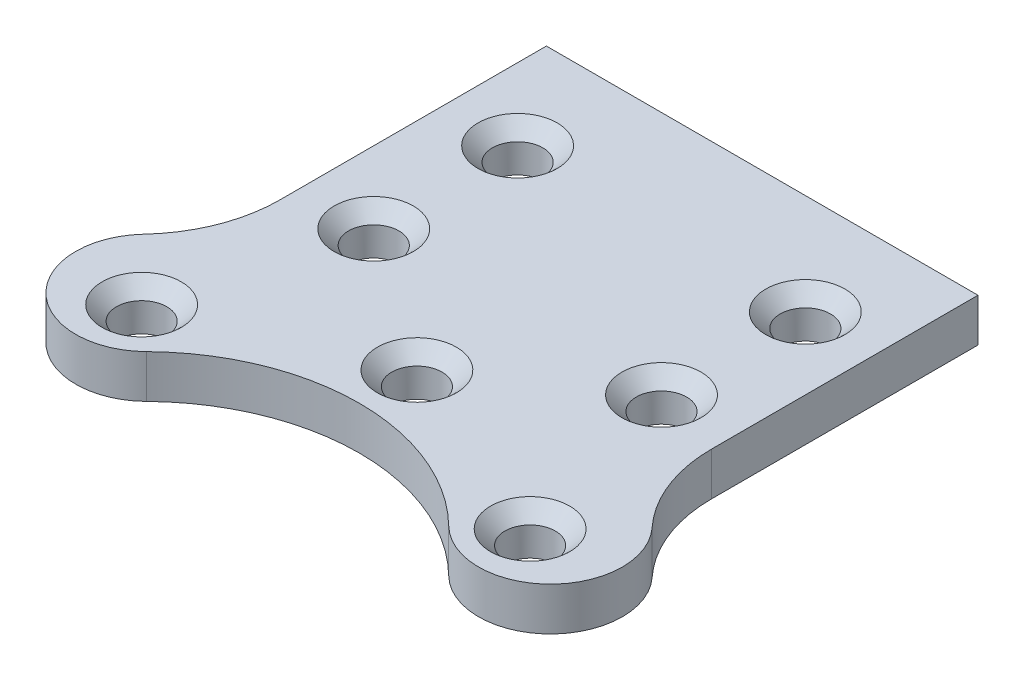
ISO-10303-21;
HEADER;
FILE_DESCRIPTION(('STEP AP214'),'2;1');
FILE_NAME('part.step','',(''),(''),'','','');
FILE_SCHEMA(('AUTOMOTIVE_DESIGN { 1 0 10303 214 1 1 1 1 }'));
ENDSEC;
DATA;
#1=APPLICATION_CONTEXT('core data for automotive mechanical design processes');
#2=APPLICATION_PROTOCOL_DEFINITION('international standard','automotive_design',2000,#1);
#3=PRODUCT_CONTEXT('',#1,'mechanical');
#4=PRODUCT('Part','Part','',(#3));
#5=PRODUCT_RELATED_PRODUCT_CATEGORY('part','',(#4));
#6=PRODUCT_DEFINITION_FORMATION('','',#4);
#7=PRODUCT_DEFINITION_CONTEXT('part definition',#1,'design');
#8=PRODUCT_DEFINITION('design','',#6,#7);
#9=PRODUCT_DEFINITION_SHAPE('','',#8);
#10=(LENGTH_UNIT() NAMED_UNIT(*) SI_UNIT(.MILLI.,.METRE.));
#11=(NAMED_UNIT(*) PLANE_ANGLE_UNIT() SI_UNIT($,.RADIAN.));
#12=(NAMED_UNIT(*) SI_UNIT($,.STERADIAN.) SOLID_ANGLE_UNIT());
#13=UNCERTAINTY_MEASURE_WITH_UNIT(LENGTH_MEASURE(1.E-05),#10,'distance_accuracy_value','');
#14=(GEOMETRIC_REPRESENTATION_CONTEXT(3) GLOBAL_UNCERTAINTY_ASSIGNED_CONTEXT((#13)) GLOBAL_UNIT_ASSIGNED_CONTEXT((#10,
#11,#12)) REPRESENTATION_CONTEXT('',''));
#15=CARTESIAN_POINT('',(0.,0.,0.));
#16=DIRECTION('',(0.,0.,1.));
#17=DIRECTION('',(1.,0.,0.));
#18=AXIS2_PLACEMENT_3D('',#15,#16,#17);
#19=CARTESIAN_POINT('',(0.,3.,15.));
#20=DIRECTION('',(0.,-1.,0.));
#21=DIRECTION('',(0.,0.,-1.));
#22=AXIS2_PLACEMENT_3D('',#19,#20,#21);
#23=CYLINDRICAL_SURFACE('',#22,15.);
#24=CARTESIAN_POINT('',(0.,0.,15.));
#25=DIRECTION('',(0.,-1.,0.));
#26=DIRECTION('',(0.,0.,-1.));
#27=AXIS2_PLACEMENT_3D('',#24,#25,#26);
#28=CIRCLE('',#27,15.);
#29=CARTESIAN_POINT('',(-10.5,0.,4.28785735718572));
#30=VERTEX_POINT('',#29);
#31=CARTESIAN_POINT('',(10.5,0.,4.28785735718573));
#32=VERTEX_POINT('',#31);
#33=EDGE_CURVE('E124',#30,#32,#28,.T.);
#34=ORIENTED_EDGE('',*,*,#33,.T.);
#35=DIRECTION('',(0.,-1.,0.));
#36=VECTOR('',#35,1.);
#37=CARTESIAN_POINT('',(10.5,3.,4.28785735718573));
#38=LINE('',#37,#36);
#39=CARTESIAN_POINT('',(10.5,3.,4.28785735718573));
#40=VERTEX_POINT('',#39);
#41=EDGE_CURVE('E105',#40,#32,#38,.T.);
#42=ORIENTED_EDGE('',*,*,#41,.F.);
#43=CARTESIAN_POINT('',(0.,3.,15.));
#44=DIRECTION('',(0.,-1.,0.));
#45=DIRECTION('',(0.,0.,-1.));
#46=AXIS2_PLACEMENT_3D('',#43,#44,#45);
#47=CIRCLE('',#46,15.);
#48=CARTESIAN_POINT('',(-10.5,3.,4.28785735718572));
#49=VERTEX_POINT('',#48);
#50=EDGE_CURVE('E112',#49,#40,#47,.T.);
#51=ORIENTED_EDGE('',*,*,#50,.F.);
#52=DIRECTION('',(0.,-1.,0.));
#53=VECTOR('',#52,1.);
#54=CARTESIAN_POINT('',(-10.5,3.,4.28785735718572));
#55=LINE('',#54,#53);
#56=EDGE_CURVE('E263',#49,#30,#55,.T.);
#57=ORIENTED_EDGE('',*,*,#56,.T.);
#58=EDGE_LOOP('',(#34,#42,#51,#57));
#59=FACE_BOUND('',#58,.T.);
#60=ADVANCED_FACE('F33',(#59),#23,.F.);
#61=CARTESIAN_POINT('',(14.,3.,0.717143142914298));
#62=DIRECTION('',(0.,-1.,0.));
#63=DIRECTION('',(0.,0.,-1.));
#64=AXIS2_PLACEMENT_3D('',#61,#62,#63);
#65=CYLINDRICAL_SURFACE('',#64,5.);
#66=CARTESIAN_POINT('',(14.,0.,0.717143142914298));
#67=DIRECTION('',(0.,1.,0.));
#68=DIRECTION('',(0.,0.,1.));
#69=AXIS2_PLACEMENT_3D('',#66,#67,#68);
#70=CIRCLE('',#69,5.);
#71=CARTESIAN_POINT('',(17.6666666666667,0.,-2.68220319948089));
#72=VERTEX_POINT('',#71);
#73=EDGE_CURVE('E251',#32,#72,#70,.T.);
#74=ORIENTED_EDGE('',*,*,#73,.T.);
#75=DIRECTION('',(0.,-1.,0.));
#76=VECTOR('',#75,1.);
#77=CARTESIAN_POINT('',(17.6666666666667,3.,-2.68220319948089));
#78=LINE('',#77,#76);
#79=CARTESIAN_POINT('',(17.6666666666667,3.,-2.68220319948089));
#80=VERTEX_POINT('',#79);
#81=EDGE_CURVE('E108',#72,#80,#78,.F.);
#82=ORIENTED_EDGE('',*,*,#81,.T.);
#83=CARTESIAN_POINT('',(14.,3.,0.717143142914298));
#84=DIRECTION('',(0.,1.,0.));
#85=DIRECTION('',(0.,0.,1.));
#86=AXIS2_PLACEMENT_3D('',#83,#84,#85);
#87=CIRCLE('',#86,5.);
#88=EDGE_CURVE('E100',#40,#80,#87,.T.);
#89=ORIENTED_EDGE('',*,*,#88,.F.);
#90=ORIENTED_EDGE('',*,*,#41,.T.);
#91=EDGE_LOOP('',(#74,#82,#89,#90));
#92=FACE_BOUND('',#91,.T.);
#93=ADVANCED_FACE('F103',(#92),#65,.T.);
#94=CARTESIAN_POINT('',(15.,3.,-28.));
#95=DIRECTION('',(-1.,0.,0.));
#96=DIRECTION('',(0.,0.,1.));
#97=AXIS2_PLACEMENT_3D('',#94,#95,#96);
#98=PLANE('',#97);
#99=DIRECTION('',(0.,0.,-1.));
#100=VECTOR('',#99,1.);
#101=CARTESIAN_POINT('',(15.,3.,-28.));
#102=LINE('',#101,#100);
#103=CARTESIAN_POINT('',(15.,3.,-9.48089588427127));
#104=VERTEX_POINT('',#103);
#105=CARTESIAN_POINT('',(15.,3.,-28.));
#106=VERTEX_POINT('',#105);
#107=EDGE_CURVE('E111',#104,#106,#102,.T.);
#108=ORIENTED_EDGE('',*,*,#107,.F.);
#109=DIRECTION('',(0.,1.,0.));
#110=VECTOR('',#109,1.);
#111=CARTESIAN_POINT('',(15.,0.,-9.48089588427127));
#112=LINE('',#111,#110);
#113=CARTESIAN_POINT('',(15.,0.,-9.48089588427127));
#114=VERTEX_POINT('',#113);
#115=EDGE_CURVE('E125',#104,#114,#112,.F.);
#116=ORIENTED_EDGE('',*,*,#115,.T.);
#117=DIRECTION('',(0.,0.,-1.));
#118=VECTOR('',#117,1.);
#119=CARTESIAN_POINT('',(15.,0.,-28.));
#120=LINE('',#119,#118);
#121=CARTESIAN_POINT('',(15.,0.,-28.));
#122=VERTEX_POINT('',#121);
#123=EDGE_CURVE('E266',#114,#122,#120,.T.);
#124=ORIENTED_EDGE('',*,*,#123,.T.);
#125=DIRECTION('',(0.,-1.,0.));
#126=VECTOR('',#125,1.);
#127=CARTESIAN_POINT('',(15.,3.,-28.));
#128=LINE('',#127,#126);
#129=EDGE_CURVE('E126',#106,#122,#128,.T.);
#130=ORIENTED_EDGE('',*,*,#129,.F.);
#131=EDGE_LOOP('',(#108,#116,#124,#130));
#132=FACE_BOUND('',#131,.T.);
#133=ADVANCED_FACE('F206',(#132),#98,.F.);
#134=CARTESIAN_POINT('',(-15.,3.,-28.));
#135=DIRECTION('',(0.,0.,1.));
#136=DIRECTION('',(1.,0.,0.));
#137=AXIS2_PLACEMENT_3D('',#134,#135,#136);
#138=PLANE('',#137);
#139=DIRECTION('',(-1.,0.,0.));
#140=VECTOR('',#139,1.);
#141=CARTESIAN_POINT('',(-15.,0.,-28.));
#142=LINE('',#141,#140);
#143=CARTESIAN_POINT('',(-15.,0.,-28.));
#144=VERTEX_POINT('',#143);
#145=EDGE_CURVE('E268',#122,#144,#142,.T.);
#146=ORIENTED_EDGE('',*,*,#145,.T.);
#147=DIRECTION('',(0.,-1.,0.));
#148=VECTOR('',#147,1.);
#149=CARTESIAN_POINT('',(-15.,3.,-28.));
#150=LINE('',#149,#148);
#151=CARTESIAN_POINT('',(-15.,3.,-28.));
#152=VERTEX_POINT('',#151);
#153=EDGE_CURVE('E131',#152,#144,#150,.T.);
#154=ORIENTED_EDGE('',*,*,#153,.F.);
#155=DIRECTION('',(-1.,0.,0.));
#156=VECTOR('',#155,1.);
#157=CARTESIAN_POINT('',(-15.,3.,-28.));
#158=LINE('',#157,#156);
#159=EDGE_CURVE('E259',#106,#152,#158,.T.);
#160=ORIENTED_EDGE('',*,*,#159,.F.);
#161=ORIENTED_EDGE('',*,*,#129,.T.);
#162=EDGE_LOOP('',(#146,#154,#160,#161));
#163=FACE_BOUND('',#162,.T.);
#164=ADVANCED_FACE('F280',(#163),#138,.F.);
#165=CARTESIAN_POINT('',(-15.,3.,-4.18183634265206));
#166=DIRECTION('',(1.,0.,0.));
#167=DIRECTION('',(0.,0.,-1.));
#168=AXIS2_PLACEMENT_3D('',#165,#166,#167);
#169=PLANE('',#168);
#170=DIRECTION('',(0.,0.,1.));
#171=VECTOR('',#170,1.);
#172=CARTESIAN_POINT('',(-15.,0.,-4.18183634265206));
#173=LINE('',#172,#171);
#174=CARTESIAN_POINT('',(-15.,0.,-9.48089588427127));
#175=VERTEX_POINT('',#174);
#176=EDGE_CURVE('E270',#144,#175,#173,.T.);
#177=ORIENTED_EDGE('',*,*,#176,.T.);
#178=DIRECTION('',(0.,1.,0.));
#179=VECTOR('',#178,1.);
#180=CARTESIAN_POINT('',(-15.,3.,-9.48089588427127));
#181=LINE('',#180,#179);
#182=CARTESIAN_POINT('',(-15.,3.,-9.48089588427127));
#183=VERTEX_POINT('',#182);
#184=EDGE_CURVE('E48',#175,#183,#181,.T.);
#185=ORIENTED_EDGE('',*,*,#184,.T.);
#186=DIRECTION('',(0.,0.,1.));
#187=VECTOR('',#186,1.);
#188=CARTESIAN_POINT('',(-15.,3.,-4.18183634265206));
#189=LINE('',#188,#187);
#190=EDGE_CURVE('E261',#152,#183,#189,.T.);
#191=ORIENTED_EDGE('',*,*,#190,.F.);
#192=ORIENTED_EDGE('',*,*,#153,.T.);
#193=EDGE_LOOP('',(#177,#185,#191,#192));
#194=FACE_BOUND('',#193,.T.);
#195=ADVANCED_FACE('F275',(#194),#169,.F.);
#196=CARTESIAN_POINT('',(-14.,3.,0.717143142914298));
#197=DIRECTION('',(0.,-1.,0.));
#198=DIRECTION('',(0.,0.,-1.));
#199=AXIS2_PLACEMENT_3D('',#196,#197,#198);
#200=CYLINDRICAL_SURFACE('',#199,5.);
#201=CARTESIAN_POINT('',(-14.,3.,0.717143142914298));
#202=DIRECTION('',(0.,1.,0.));
#203=DIRECTION('',(0.,0.,-1.));
#204=AXIS2_PLACEMENT_3D('',#201,#202,#203);
#205=CIRCLE('',#204,5.);
#206=CARTESIAN_POINT('',(-17.6666666666667,3.,-2.68220319948089));
#207=VERTEX_POINT('',#206);
#208=EDGE_CURVE('E117',#207,#49,#205,.T.);
#209=ORIENTED_EDGE('',*,*,#208,.F.);
#210=DIRECTION('',(0.,-1.,0.));
#211=VECTOR('',#210,1.);
#212=CARTESIAN_POINT('',(-17.6666666666667,3.,-2.68220319948089));
#213=LINE('',#212,#211);
#214=CARTESIAN_POINT('',(-17.6666666666667,0.,-2.68220319948089));
#215=VERTEX_POINT('',#214);
#216=EDGE_CURVE('E136',#207,#215,#213,.T.);
#217=ORIENTED_EDGE('',*,*,#216,.T.);
#218=CARTESIAN_POINT('',(-14.,0.,0.717143142914298));
#219=DIRECTION('',(0.,1.,0.));
#220=DIRECTION('',(0.,0.,-1.));
#221=AXIS2_PLACEMENT_3D('',#218,#219,#220);
#222=CIRCLE('',#221,5.);
#223=EDGE_CURVE('E121',#215,#30,#222,.T.);
#224=ORIENTED_EDGE('',*,*,#223,.T.);
#225=ORIENTED_EDGE('',*,*,#56,.F.);
#226=EDGE_LOOP('',(#209,#217,#224,#225));
#227=FACE_BOUND('',#226,.T.);
#228=ADVANCED_FACE('F286',(#227),#200,.T.);
#229=CARTESIAN_POINT('',(0.,3.,15.));
#230=DIRECTION('',(0.,-1.,0.));
#231=DIRECTION('',(0.,0.,-1.));
#232=AXIS2_PLACEMENT_3D('',#229,#230,#231);
#233=PLANE('',#232);
#234=CARTESIAN_POINT('',(13.5,3.,1.63025804287906));
#235=DIRECTION('',(0.,-1.,0.));
#236=DIRECTION('',(0.,0.,-1.));
#237=AXIS2_PLACEMENT_3D('',#234,#235,#236);
#238=CIRCLE('',#237,2.75);
#239=CARTESIAN_POINT('',(13.5,3.,-1.11974195712094));
#240=VERTEX_POINT('',#239);
#241=EDGE_CURVE('E168',#240,#240,#238,.T.);
#242=ORIENTED_EDGE('',*,*,#241,.T.);
#243=EDGE_LOOP('',(#242));
#244=FACE_BOUND('',#243,.T.);
#245=CARTESIAN_POINT('',(-13.5,3.,1.63025804287906));
#246=DIRECTION('',(0.,-1.,0.));
#247=DIRECTION('',(0.,0.,-1.));
#248=AXIS2_PLACEMENT_3D('',#245,#246,#247);
#249=CIRCLE('',#248,2.75);
#250=CARTESIAN_POINT('',(-13.5,3.,-1.11974195712094));
#251=VERTEX_POINT('',#250);
#252=EDGE_CURVE('E165',#251,#251,#249,.T.);
#253=ORIENTED_EDGE('',*,*,#252,.T.);
#254=EDGE_LOOP('',(#253));
#255=FACE_BOUND('',#254,.T.);
#256=CARTESIAN_POINT('',(-10.,3.,-11.));
#257=DIRECTION('',(0.,-1.,0.));
#258=DIRECTION('',(0.,0.,-1.));
#259=AXIS2_PLACEMENT_3D('',#256,#257,#258);
#260=CIRCLE('',#259,2.75000000000001);
#261=CARTESIAN_POINT('',(-10.,3.,-13.75));
#262=VERTEX_POINT('',#261);
#263=EDGE_CURVE('E162',#262,#262,#260,.T.);
#264=ORIENTED_EDGE('',*,*,#263,.T.);
#265=EDGE_LOOP('',(#264));
#266=FACE_BOUND('',#265,.T.);
#267=CARTESIAN_POINT('',(0.,3.,-4.));
#268=DIRECTION('',(0.,-1.,0.));
#269=DIRECTION('',(0.,0.,-1.));
#270=AXIS2_PLACEMENT_3D('',#267,#268,#269);
#271=CIRCLE('',#270,2.75);
#272=CARTESIAN_POINT('',(0.,3.,-6.75));
#273=VERTEX_POINT('',#272);
#274=EDGE_CURVE('E159',#273,#273,#271,.T.);
#275=ORIENTED_EDGE('',*,*,#274,.T.);
#276=EDGE_LOOP('',(#275));
#277=FACE_BOUND('',#276,.T.);
#278=CARTESIAN_POINT('',(10.,3.,-11.));
#279=DIRECTION('',(0.,-1.,0.));
#280=DIRECTION('',(0.,0.,-1.));
#281=AXIS2_PLACEMENT_3D('',#278,#279,#280);
#282=CIRCLE('',#281,2.75000000000001);
#283=CARTESIAN_POINT('',(10.,3.,-13.75));
#284=VERTEX_POINT('',#283);
#285=EDGE_CURVE('E156',#284,#284,#282,.T.);
#286=ORIENTED_EDGE('',*,*,#285,.T.);
#287=EDGE_LOOP('',(#286));
#288=FACE_BOUND('',#287,.T.);
#289=CARTESIAN_POINT('',(10.,3.,-21.));
#290=DIRECTION('',(0.,-1.,0.));
#291=DIRECTION('',(0.,0.,-1.));
#292=AXIS2_PLACEMENT_3D('',#289,#290,#291);
#293=CIRCLE('',#292,2.75);
#294=CARTESIAN_POINT('',(10.,3.,-23.75));
#295=VERTEX_POINT('',#294);
#296=EDGE_CURVE('E153',#295,#295,#293,.T.);
#297=ORIENTED_EDGE('',*,*,#296,.T.);
#298=EDGE_LOOP('',(#297));
#299=FACE_BOUND('',#298,.T.);
#300=CARTESIAN_POINT('',(-10.,3.,-21.));
#301=DIRECTION('',(0.,-1.,0.));
#302=DIRECTION('',(0.,0.,-1.));
#303=AXIS2_PLACEMENT_3D('',#300,#301,#302);
#304=CIRCLE('',#303,2.75);
#305=CARTESIAN_POINT('',(-10.,3.,-23.75));
#306=VERTEX_POINT('',#305);
#307=EDGE_CURVE('E150',#306,#306,#304,.T.);
#308=ORIENTED_EDGE('',*,*,#307,.T.);
#309=EDGE_LOOP('',(#308));
#310=FACE_BOUND('',#309,.T.);
#311=ORIENTED_EDGE('',*,*,#50,.T.);
#312=ORIENTED_EDGE('',*,*,#88,.T.);
#313=CARTESIAN_POINT('',(25.,3.,-9.48089588427127));
#314=DIRECTION('',(0.,-1.,0.));
#315=DIRECTION('',(0.,0.,-1.));
#316=AXIS2_PLACEMENT_3D('',#313,#314,#315);
#317=CIRCLE('',#316,10.);
#318=EDGE_CURVE('E142',#80,#104,#317,.T.);
#319=ORIENTED_EDGE('',*,*,#318,.T.);
#320=ORIENTED_EDGE('',*,*,#107,.T.);
#321=ORIENTED_EDGE('',*,*,#159,.T.);
#322=ORIENTED_EDGE('',*,*,#190,.T.);
#323=CARTESIAN_POINT('',(-25.,3.,-9.48089588427127));
#324=DIRECTION('',(0.,-1.,0.));
#325=DIRECTION('',(0.,0.,-1.));
#326=AXIS2_PLACEMENT_3D('',#323,#324,#325);
#327=CIRCLE('',#326,10.);
#328=EDGE_CURVE('E145',#183,#207,#327,.T.);
#329=ORIENTED_EDGE('',*,*,#328,.T.);
#330=ORIENTED_EDGE('',*,*,#208,.T.);
#331=EDGE_LOOP('',(#311,#312,#319,#320,#321,#322,#329,#330));
#332=FACE_BOUND('',#331,.T.);
#333=ADVANCED_FACE('F115',(#244,#255,#266,#277,#288,#299,#310,#332),#233,.F.);
#334=CARTESIAN_POINT('',(0.,0.,15.));
#335=DIRECTION('',(0.,-1.,0.));
#336=DIRECTION('',(0.,0.,-1.));
#337=AXIS2_PLACEMENT_3D('',#334,#335,#336);
#338=PLANE('',#337);
#339=CARTESIAN_POINT('',(10.,0.,-11.));
#340=DIRECTION('',(0.,1.,0.));
#341=DIRECTION('',(0.,0.,1.));
#342=AXIS2_PLACEMENT_3D('',#339,#340,#341);
#343=CIRCLE('',#342,1.75);
#344=CARTESIAN_POINT('',(10.,0.,-9.25));
#345=VERTEX_POINT('',#344);
#346=EDGE_CURVE('E452',#345,#345,#343,.T.);
#347=ORIENTED_EDGE('',*,*,#346,.T.);
#348=EDGE_LOOP('',(#347));
#349=FACE_BOUND('',#348,.T.);
#350=CARTESIAN_POINT('',(10.,0.,-21.));
#351=DIRECTION('',(0.,1.,0.));
#352=DIRECTION('',(0.,0.,1.));
#353=AXIS2_PLACEMENT_3D('',#350,#351,#352);
#354=CIRCLE('',#353,1.75);
#355=CARTESIAN_POINT('',(10.,0.,-19.25));
#356=VERTEX_POINT('',#355);
#357=EDGE_CURVE('E453',#356,#356,#354,.T.);
#358=ORIENTED_EDGE('',*,*,#357,.T.);
#359=EDGE_LOOP('',(#358));
#360=FACE_BOUND('',#359,.T.);
#361=CARTESIAN_POINT('',(-10.,0.,-21.));
#362=DIRECTION('',(0.,1.,0.));
#363=DIRECTION('',(0.,0.,1.));
#364=AXIS2_PLACEMENT_3D('',#361,#362,#363);
#365=CIRCLE('',#364,1.75);
#366=CARTESIAN_POINT('',(-10.,0.,-19.25));
#367=VERTEX_POINT('',#366);
#368=EDGE_CURVE('E456',#367,#367,#365,.T.);
#369=ORIENTED_EDGE('',*,*,#368,.T.);
#370=EDGE_LOOP('',(#369));
#371=FACE_BOUND('',#370,.T.);
#372=CARTESIAN_POINT('',(-10.,0.,-11.));
#373=DIRECTION('',(0.,1.,0.));
#374=DIRECTION('',(0.,0.,1.));
#375=AXIS2_PLACEMENT_3D('',#372,#373,#374);
#376=CIRCLE('',#375,1.75);
#377=CARTESIAN_POINT('',(-10.,0.,-9.25));
#378=VERTEX_POINT('',#377);
#379=EDGE_CURVE('E461',#378,#378,#376,.T.);
#380=ORIENTED_EDGE('',*,*,#379,.T.);
#381=EDGE_LOOP('',(#380));
#382=FACE_BOUND('',#381,.T.);
#383=CARTESIAN_POINT('',(-13.5,0.,1.63025804287906));
#384=DIRECTION('',(0.,1.,0.));
#385=DIRECTION('',(0.,0.,1.));
#386=AXIS2_PLACEMENT_3D('',#383,#384,#385);
#387=CIRCLE('',#386,1.75);
#388=CARTESIAN_POINT('',(-13.5,0.,3.38025804287906));
#389=VERTEX_POINT('',#388);
#390=EDGE_CURVE('E254',#389,#389,#387,.T.);
#391=ORIENTED_EDGE('',*,*,#390,.T.);
#392=EDGE_LOOP('',(#391));
#393=FACE_BOUND('',#392,.T.);
#394=CARTESIAN_POINT('',(13.5,0.,1.63025804287906));
#395=DIRECTION('',(0.,1.,0.));
#396=DIRECTION('',(0.,0.,1.));
#397=AXIS2_PLACEMENT_3D('',#394,#395,#396);
#398=CIRCLE('',#397,1.75);
#399=CARTESIAN_POINT('',(13.5,0.,3.38025804287906));
#400=VERTEX_POINT('',#399);
#401=EDGE_CURVE('E249',#400,#400,#398,.T.);
#402=ORIENTED_EDGE('',*,*,#401,.T.);
#403=EDGE_LOOP('',(#402));
#404=FACE_BOUND('',#403,.T.);
#405=CARTESIAN_POINT('',(0.,0.,-4.));
#406=DIRECTION('',(0.,1.,0.));
#407=DIRECTION('',(0.,0.,1.));
#408=AXIS2_PLACEMENT_3D('',#405,#406,#407);
#409=CIRCLE('',#408,1.75);
#410=CARTESIAN_POINT('',(0.,0.,-2.25));
#411=VERTEX_POINT('',#410);
#412=EDGE_CURVE('E247',#411,#411,#409,.T.);
#413=ORIENTED_EDGE('',*,*,#412,.T.);
#414=EDGE_LOOP('',(#413));
#415=FACE_BOUND('',#414,.T.);
#416=ORIENTED_EDGE('',*,*,#33,.F.);
#417=ORIENTED_EDGE('',*,*,#223,.F.);
#418=CARTESIAN_POINT('',(-25.,0.,-9.48089588427127));
#419=DIRECTION('',(0.,-1.,0.));
#420=DIRECTION('',(0.,0.,-1.));
#421=AXIS2_PLACEMENT_3D('',#418,#419,#420);
#422=CIRCLE('',#421,10.);
#423=EDGE_CURVE('E56',#215,#175,#422,.F.);
#424=ORIENTED_EDGE('',*,*,#423,.T.);
#425=ORIENTED_EDGE('',*,*,#176,.F.);
#426=ORIENTED_EDGE('',*,*,#145,.F.);
#427=ORIENTED_EDGE('',*,*,#123,.F.);
#428=CARTESIAN_POINT('',(25.,0.,-9.48089588427127));
#429=DIRECTION('',(0.,-1.,0.));
#430=DIRECTION('',(0.,0.,-1.));
#431=AXIS2_PLACEMENT_3D('',#428,#429,#430);
#432=CIRCLE('',#431,10.);
#433=EDGE_CURVE('E140',#114,#72,#432,.F.);
#434=ORIENTED_EDGE('',*,*,#433,.T.);
#435=ORIENTED_EDGE('',*,*,#73,.F.);
#436=EDGE_LOOP('',(#416,#417,#424,#425,#426,#427,#434,#435));
#437=FACE_BOUND('',#436,.T.);
#438=ADVANCED_FACE('F214',(#349,#360,#371,#382,#393,#404,#415,#437),#338,.T.);
#439=CARTESIAN_POINT('',(25.,3.,-9.48089588427127));
#440=DIRECTION('',(0.,-1.,0.));
#441=DIRECTION('',(0.,0.,-1.));
#442=AXIS2_PLACEMENT_3D('',#439,#440,#441);
#443=CYLINDRICAL_SURFACE('',#442,10.);
#444=ORIENTED_EDGE('',*,*,#318,.F.);
#445=ORIENTED_EDGE('',*,*,#81,.F.);
#446=ORIENTED_EDGE('',*,*,#433,.F.);
#447=ORIENTED_EDGE('',*,*,#115,.F.);
#448=EDGE_LOOP('',(#444,#445,#446,#447));
#449=FACE_BOUND('',#448,.T.);
#450=ADVANCED_FACE('F210',(#449),#443,.F.);
#451=CARTESIAN_POINT('',(-25.,3.,-9.48089588427127));
#452=DIRECTION('',(0.,-1.,0.));
#453=DIRECTION('',(0.,0.,-1.));
#454=AXIS2_PLACEMENT_3D('',#451,#452,#453);
#455=CYLINDRICAL_SURFACE('',#454,10.);
#456=ORIENTED_EDGE('',*,*,#328,.F.);
#457=ORIENTED_EDGE('',*,*,#184,.F.);
#458=ORIENTED_EDGE('',*,*,#423,.F.);
#459=ORIENTED_EDGE('',*,*,#216,.F.);
#460=EDGE_LOOP('',(#456,#457,#458,#459));
#461=FACE_BOUND('',#460,.T.);
#462=ADVANCED_FACE('F213',(#461),#455,.F.);
#463=CARTESIAN_POINT('',(0.,0.,-4.));
#464=DIRECTION('',(0.,1.,0.));
#465=DIRECTION('',(0.,0.,1.));
#466=AXIS2_PLACEMENT_3D('',#463,#464,#465);
#467=CYLINDRICAL_SURFACE('',#466,1.75);
#468=CARTESIAN_POINT('',(0.,2.,-4.));
#469=DIRECTION('',(0.,-1.,0.));
#470=DIRECTION('',(0.,0.,-1.));
#471=AXIS2_PLACEMENT_3D('',#468,#469,#470);
#472=CIRCLE('',#471,1.75);
#473=CARTESIAN_POINT('',(0.,2.,-5.75));
#474=VERTEX_POINT('',#473);
#475=EDGE_CURVE('E177',#474,#474,#472,.F.);
#476=ORIENTED_EDGE('',*,*,#475,.T.);
#477=EDGE_LOOP('',(#476));
#478=FACE_BOUND('',#477,.T.);
#479=ORIENTED_EDGE('',*,*,#412,.F.);
#480=EDGE_LOOP('',(#479));
#481=FACE_BOUND('',#480,.T.);
#482=ADVANCED_FACE('F218',(#478,#481),#467,.F.);
#483=CARTESIAN_POINT('',(13.5,0.,1.63025804287906));
#484=DIRECTION('',(0.,1.,0.));
#485=DIRECTION('',(0.,0.,1.));
#486=AXIS2_PLACEMENT_3D('',#483,#484,#485);
#487=CYLINDRICAL_SURFACE('',#486,1.75);
#488=CARTESIAN_POINT('',(13.5,2.,1.63025804287906));
#489=DIRECTION('',(0.,-1.,0.));
#490=DIRECTION('',(0.,0.,-1.));
#491=AXIS2_PLACEMENT_3D('',#488,#489,#490);
#492=CIRCLE('',#491,1.75);
#493=CARTESIAN_POINT('',(13.5,2.,-0.119741957120938));
#494=VERTEX_POINT('',#493);
#495=EDGE_CURVE('E147',#494,#494,#492,.F.);
#496=ORIENTED_EDGE('',*,*,#495,.T.);
#497=EDGE_LOOP('',(#496));
#498=FACE_BOUND('',#497,.T.);
#499=ORIENTED_EDGE('',*,*,#401,.F.);
#500=EDGE_LOOP('',(#499));
#501=FACE_BOUND('',#500,.T.);
#502=ADVANCED_FACE('F243',(#498,#501),#487,.F.);
#503=CARTESIAN_POINT('',(-13.5,0.,1.63025804287906));
#504=DIRECTION('',(0.,1.,0.));
#505=DIRECTION('',(0.,0.,1.));
#506=AXIS2_PLACEMENT_3D('',#503,#504,#505);
#507=CYLINDRICAL_SURFACE('',#506,1.75);
#508=CARTESIAN_POINT('',(-13.5,2.,1.63025804287906));
#509=DIRECTION('',(0.,-1.,0.));
#510=DIRECTION('',(0.,0.,-1.));
#511=AXIS2_PLACEMENT_3D('',#508,#509,#510);
#512=CIRCLE('',#511,1.75);
#513=CARTESIAN_POINT('',(-13.5,2.,-0.119741957120938));
#514=VERTEX_POINT('',#513);
#515=EDGE_CURVE('E171',#514,#514,#512,.F.);
#516=ORIENTED_EDGE('',*,*,#515,.T.);
#517=EDGE_LOOP('',(#516));
#518=FACE_BOUND('',#517,.T.);
#519=ORIENTED_EDGE('',*,*,#390,.F.);
#520=EDGE_LOOP('',(#519));
#521=FACE_BOUND('',#520,.T.);
#522=ADVANCED_FACE('F359',(#518,#521),#507,.F.);
#523=CARTESIAN_POINT('',(-10.,0.,-11.));
#524=DIRECTION('',(0.,1.,0.));
#525=DIRECTION('',(0.,0.,1.));
#526=AXIS2_PLACEMENT_3D('',#523,#524,#525);
#527=CYLINDRICAL_SURFACE('',#526,1.75);
#528=CARTESIAN_POINT('',(-10.,1.99999999999999,-11.));
#529=DIRECTION('',(0.,-1.,0.));
#530=DIRECTION('',(0.,0.,-1.));
#531=AXIS2_PLACEMENT_3D('',#528,#529,#530);
#532=CIRCLE('',#531,1.75);
#533=CARTESIAN_POINT('',(-10.,1.99999999999999,-12.75));
#534=VERTEX_POINT('',#533);
#535=EDGE_CURVE('E174',#534,#534,#532,.F.);
#536=ORIENTED_EDGE('',*,*,#535,.T.);
#537=EDGE_LOOP('',(#536));
#538=FACE_BOUND('',#537,.T.);
#539=ORIENTED_EDGE('',*,*,#379,.F.);
#540=EDGE_LOOP('',(#539));
#541=FACE_BOUND('',#540,.T.);
#542=ADVANCED_FACE('F369',(#538,#541),#527,.F.);
#543=CARTESIAN_POINT('',(-10.,0.,-21.));
#544=DIRECTION('',(0.,1.,0.));
#545=DIRECTION('',(0.,0.,1.));
#546=AXIS2_PLACEMENT_3D('',#543,#544,#545);
#547=CYLINDRICAL_SURFACE('',#546,1.75);
#548=CARTESIAN_POINT('',(-10.,2.,-21.));
#549=DIRECTION('',(0.,-1.,0.));
#550=DIRECTION('',(0.,0.,-1.));
#551=AXIS2_PLACEMENT_3D('',#548,#549,#550);
#552=CIRCLE('',#551,1.75);
#553=CARTESIAN_POINT('',(-10.,2.,-22.75));
#554=VERTEX_POINT('',#553);
#555=EDGE_CURVE('E11',#554,#554,#552,.F.);
#556=ORIENTED_EDGE('',*,*,#555,.T.);
#557=EDGE_LOOP('',(#556));
#558=FACE_BOUND('',#557,.T.);
#559=ORIENTED_EDGE('',*,*,#368,.F.);
#560=EDGE_LOOP('',(#559));
#561=FACE_BOUND('',#560,.T.);
#562=ADVANCED_FACE('F379',(#558,#561),#547,.F.);
#563=CARTESIAN_POINT('',(10.,0.,-21.));
#564=DIRECTION('',(0.,1.,0.));
#565=DIRECTION('',(0.,0.,1.));
#566=AXIS2_PLACEMENT_3D('',#563,#564,#565);
#567=CYLINDRICAL_SURFACE('',#566,1.75);
#568=CARTESIAN_POINT('',(10.,2.,-21.));
#569=DIRECTION('',(0.,-1.,0.));
#570=DIRECTION('',(0.,0.,-1.));
#571=AXIS2_PLACEMENT_3D('',#568,#569,#570);
#572=CIRCLE('',#571,1.75);
#573=CARTESIAN_POINT('',(10.,2.,-22.75));
#574=VERTEX_POINT('',#573);
#575=EDGE_CURVE('E41',#574,#574,#572,.F.);
#576=ORIENTED_EDGE('',*,*,#575,.T.);
#577=EDGE_LOOP('',(#576));
#578=FACE_BOUND('',#577,.T.);
#579=ORIENTED_EDGE('',*,*,#357,.F.);
#580=EDGE_LOOP('',(#579));
#581=FACE_BOUND('',#580,.T.);
#582=ADVANCED_FACE('F185',(#578,#581),#567,.F.);
#583=CARTESIAN_POINT('',(10.,0.,-11.));
#584=DIRECTION('',(0.,1.,0.));
#585=DIRECTION('',(0.,0.,1.));
#586=AXIS2_PLACEMENT_3D('',#583,#584,#585);
#587=CYLINDRICAL_SURFACE('',#586,1.75);
#588=CARTESIAN_POINT('',(10.,1.99999999999999,-11.));
#589=DIRECTION('',(0.,-1.,0.));
#590=DIRECTION('',(0.,0.,-1.));
#591=AXIS2_PLACEMENT_3D('',#588,#589,#590);
#592=CIRCLE('',#591,1.75);
#593=CARTESIAN_POINT('',(10.,1.99999999999999,-12.75));
#594=VERTEX_POINT('',#593);
#595=EDGE_CURVE('E180',#594,#594,#592,.F.);
#596=ORIENTED_EDGE('',*,*,#595,.T.);
#597=EDGE_LOOP('',(#596));
#598=FACE_BOUND('',#597,.T.);
#599=ORIENTED_EDGE('',*,*,#346,.F.);
#600=EDGE_LOOP('',(#599));
#601=FACE_BOUND('',#600,.T.);
#602=ADVANCED_FACE('F224',(#598,#601),#587,.F.);
#603=CARTESIAN_POINT('',(13.5,2.,1.63025804287906));
#604=DIRECTION('',(0.,1.,0.));
#605=DIRECTION('',(0.,0.,1.));
#606=AXIS2_PLACEMENT_3D('',#603,#604,#605);
#607=CONICAL_SURFACE('',#606,1.75,0.785398163397449);
#608=ORIENTED_EDGE('',*,*,#241,.F.);
#609=EDGE_LOOP('',(#608));
#610=FACE_BOUND('',#609,.T.);
#611=ORIENTED_EDGE('',*,*,#495,.F.);
#612=EDGE_LOOP('',(#611));
#613=FACE_BOUND('',#612,.T.);
#614=ADVANCED_FACE('F220',(#610,#613),#607,.F.);
#615=CARTESIAN_POINT('',(-13.5,2.,1.63025804287906));
#616=DIRECTION('',(0.,1.,0.));
#617=DIRECTION('',(0.,0.,1.));
#618=AXIS2_PLACEMENT_3D('',#615,#616,#617);
#619=CONICAL_SURFACE('',#618,1.75,0.785398163397449);
#620=ORIENTED_EDGE('',*,*,#252,.F.);
#621=EDGE_LOOP('',(#620));
#622=FACE_BOUND('',#621,.T.);
#623=ORIENTED_EDGE('',*,*,#515,.F.);
#624=EDGE_LOOP('',(#623));
#625=FACE_BOUND('',#624,.T.);
#626=ADVANCED_FACE('F223',(#622,#625),#619,.F.);
#627=CARTESIAN_POINT('',(-10.,1.99999999999999,-11.));
#628=DIRECTION('',(0.,1.,0.));
#629=DIRECTION('',(0.,0.,1.));
#630=AXIS2_PLACEMENT_3D('',#627,#628,#629);
#631=CONICAL_SURFACE('',#630,1.75,0.785398163397449);
#632=ORIENTED_EDGE('',*,*,#263,.F.);
#633=EDGE_LOOP('',(#632));
#634=FACE_BOUND('',#633,.T.);
#635=ORIENTED_EDGE('',*,*,#535,.F.);
#636=EDGE_LOOP('',(#635));
#637=FACE_BOUND('',#636,.T.);
#638=ADVANCED_FACE('F228',(#634,#637),#631,.F.);
#639=CARTESIAN_POINT('',(0.,2.,-4.));
#640=DIRECTION('',(0.,1.,0.));
#641=DIRECTION('',(0.,0.,1.));
#642=AXIS2_PLACEMENT_3D('',#639,#640,#641);
#643=CONICAL_SURFACE('',#642,1.75,0.785398163397449);
#644=ORIENTED_EDGE('',*,*,#274,.F.);
#645=EDGE_LOOP('',(#644));
#646=FACE_BOUND('',#645,.T.);
#647=ORIENTED_EDGE('',*,*,#475,.F.);
#648=EDGE_LOOP('',(#647));
#649=FACE_BOUND('',#648,.T.);
#650=ADVANCED_FACE('F197',(#646,#649),#643,.F.);
#651=CARTESIAN_POINT('',(10.,1.99999999999999,-11.));
#652=DIRECTION('',(0.,1.,0.));
#653=DIRECTION('',(0.,0.,1.));
#654=AXIS2_PLACEMENT_3D('',#651,#652,#653);
#655=CONICAL_SURFACE('',#654,1.75,0.785398163397449);
#656=ORIENTED_EDGE('',*,*,#285,.F.);
#657=EDGE_LOOP('',(#656));
#658=FACE_BOUND('',#657,.T.);
#659=ORIENTED_EDGE('',*,*,#595,.F.);
#660=EDGE_LOOP('',(#659));
#661=FACE_BOUND('',#660,.T.);
#662=ADVANCED_FACE('F190',(#658,#661),#655,.F.);
#663=CARTESIAN_POINT('',(10.,2.,-21.));
#664=DIRECTION('',(0.,1.,0.));
#665=DIRECTION('',(0.,0.,1.));
#666=AXIS2_PLACEMENT_3D('',#663,#664,#665);
#667=CONICAL_SURFACE('',#666,1.75,0.785398163397449);
#668=ORIENTED_EDGE('',*,*,#296,.F.);
#669=EDGE_LOOP('',(#668));
#670=FACE_BOUND('',#669,.T.);
#671=ORIENTED_EDGE('',*,*,#575,.F.);
#672=EDGE_LOOP('',(#671));
#673=FACE_BOUND('',#672,.T.);
#674=ADVANCED_FACE('F188',(#670,#673),#667,.F.);
#675=CARTESIAN_POINT('',(-10.,2.,-21.));
#676=DIRECTION('',(0.,1.,0.));
#677=DIRECTION('',(0.,0.,1.));
#678=AXIS2_PLACEMENT_3D('',#675,#676,#677);
#679=CONICAL_SURFACE('',#678,1.75,0.785398163397449);
#680=ORIENTED_EDGE('',*,*,#307,.F.);
#681=EDGE_LOOP('',(#680));
#682=FACE_BOUND('',#681,.T.);
#683=ORIENTED_EDGE('',*,*,#555,.F.);
#684=EDGE_LOOP('',(#683));
#685=FACE_BOUND('',#684,.T.);
#686=ADVANCED_FACE('F35',(#682,#685),#679,.F.);
#687=CLOSED_SHELL('',(#60,#93,#133,#164,#195,#228,#333,#438,#450,#462,#482,#502,#522,#542,#562,
#582,#602,#614,#626,#638,#650,#662,#674,#686));
#688=MANIFOLD_SOLID_BREP('B2',#687);
#689=ADVANCED_BREP_SHAPE_REPRESENTATION('',(#18,#688),#14);
#690=SHAPE_DEFINITION_REPRESENTATION(#9,#689);
ENDSEC;
END-ISO-10303-21;
